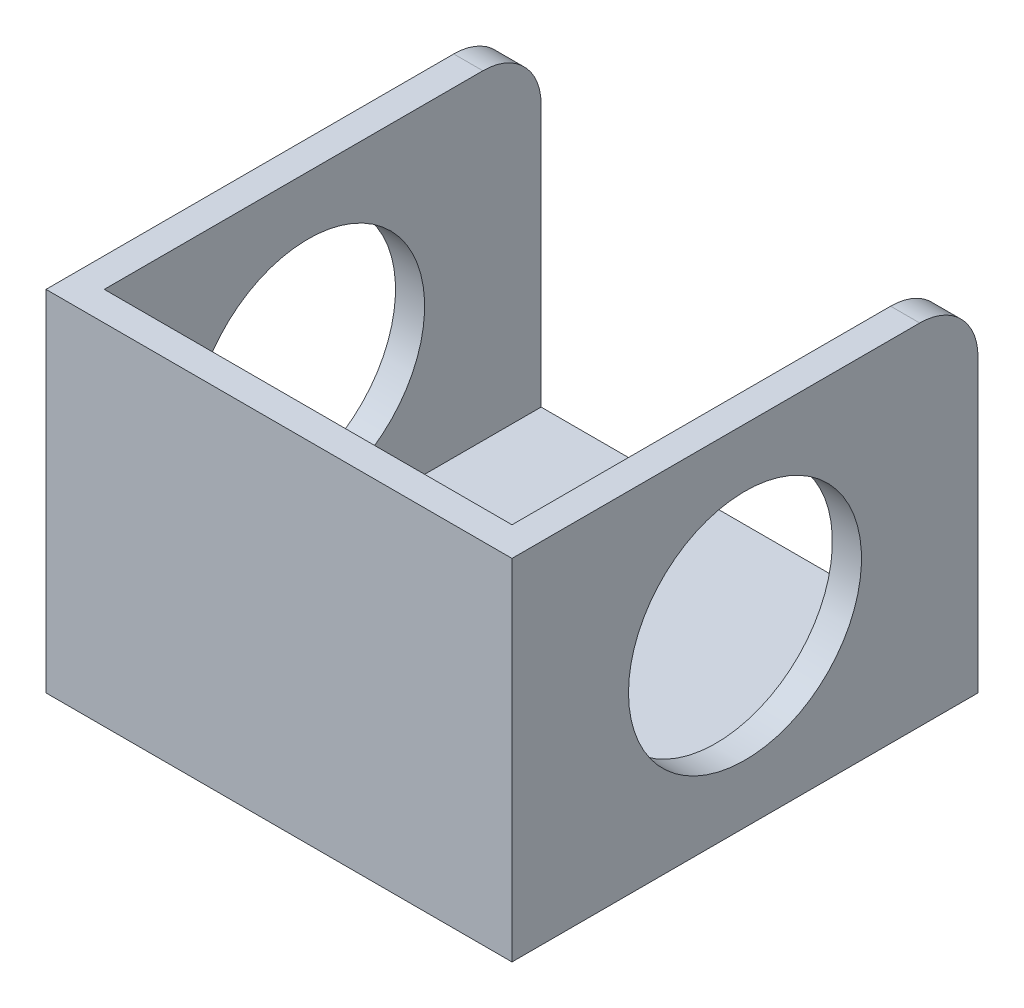
ISO-10303-21;
HEADER;
FILE_DESCRIPTION(('STEP AP214'),'2;1');
FILE_NAME('part.step','',(''),(''),'','','');
FILE_SCHEMA(('AUTOMOTIVE_DESIGN { 1 0 10303 214 1 1 1 1 }'));
ENDSEC;
DATA;
#1=APPLICATION_CONTEXT('core data for automotive mechanical design processes');
#2=APPLICATION_PROTOCOL_DEFINITION('international standard','automotive_design',2000,#1);
#3=PRODUCT_CONTEXT('',#1,'mechanical');
#4=PRODUCT('Part','Part','',(#3));
#5=PRODUCT_RELATED_PRODUCT_CATEGORY('part','',(#4));
#6=PRODUCT_DEFINITION_FORMATION('','',#4);
#7=PRODUCT_DEFINITION_CONTEXT('part definition',#1,'design');
#8=PRODUCT_DEFINITION('design','',#6,#7);
#9=PRODUCT_DEFINITION_SHAPE('','',#8);
#10=(LENGTH_UNIT() NAMED_UNIT(*) SI_UNIT(.MILLI.,.METRE.));
#11=(NAMED_UNIT(*) PLANE_ANGLE_UNIT() SI_UNIT($,.RADIAN.));
#12=(NAMED_UNIT(*) SI_UNIT($,.STERADIAN.) SOLID_ANGLE_UNIT());
#13=UNCERTAINTY_MEASURE_WITH_UNIT(LENGTH_MEASURE(1.E-05),#10,'distance_accuracy_value','');
#14=(GEOMETRIC_REPRESENTATION_CONTEXT(3) GLOBAL_UNCERTAINTY_ASSIGNED_CONTEXT((#13)) GLOBAL_UNIT_ASSIGNED_CONTEXT((#10,
#11,#12)) REPRESENTATION_CONTEXT('',''));
#15=CARTESIAN_POINT('',(0.,0.,0.));
#16=DIRECTION('',(0.,0.,1.));
#17=DIRECTION('',(1.,0.,0.));
#18=AXIS2_PLACEMENT_3D('',#15,#16,#17);
#19=CARTESIAN_POINT('',(0.,152.4,-101.6));
#20=DIRECTION('',(0.,0.,-1.));
#21=DIRECTION('',(-1.,0.,0.));
#22=AXIS2_PLACEMENT_3D('',#19,#20,#21);
#23=PLANE('',#22);
#24=DIRECTION('',(0.,-1.,0.));
#25=VECTOR('',#24,1.);
#26=CARTESIAN_POINT('',(88.8999999999999,152.4,-101.6));
#27=LINE('',#26,#25);
#28=CARTESIAN_POINT('',(88.8999999999999,127.,-101.6));
#29=VERTEX_POINT('',#28);
#30=CARTESIAN_POINT('',(88.8999999999999,12.7,-101.6));
#31=VERTEX_POINT('',#30);
#32=EDGE_CURVE('E135',#29,#31,#27,.T.);
#33=ORIENTED_EDGE('',*,*,#32,.F.);
#34=DIRECTION('',(1.,0.,0.));
#35=VECTOR('',#34,1.);
#36=CARTESIAN_POINT('',(0.,127.,-101.6));
#37=LINE('',#36,#35);
#38=CARTESIAN_POINT('',(101.6,127.,-101.6));
#39=VERTEX_POINT('',#38);
#40=EDGE_CURVE('E198',#29,#39,#37,.T.);
#41=ORIENTED_EDGE('',*,*,#40,.T.);
#42=DIRECTION('',(0.,-1.,0.));
#43=VECTOR('',#42,1.);
#44=CARTESIAN_POINT('',(101.6,152.4,-101.6));
#45=LINE('',#44,#43);
#46=CARTESIAN_POINT('',(101.6,0.,-101.6));
#47=VERTEX_POINT('',#46);
#48=EDGE_CURVE('E180',#39,#47,#45,.T.);
#49=ORIENTED_EDGE('',*,*,#48,.T.);
#50=DIRECTION('',(1.,0.,0.));
#51=VECTOR('',#50,1.);
#52=CARTESIAN_POINT('',(0.,0.,-101.6));
#53=LINE('',#52,#51);
#54=CARTESIAN_POINT('',(-101.6,0.,-101.6));
#55=VERTEX_POINT('',#54);
#56=EDGE_CURVE('E167',#55,#47,#53,.T.);
#57=ORIENTED_EDGE('',*,*,#56,.F.);
#58=DIRECTION('',(0.,-1.,0.));
#59=VECTOR('',#58,1.);
#60=CARTESIAN_POINT('',(-101.6,152.4,-101.6));
#61=LINE('',#60,#59);
#62=CARTESIAN_POINT('',(-101.6,127.,-101.6));
#63=VERTEX_POINT('',#62);
#64=EDGE_CURVE('E178',#63,#55,#61,.T.);
#65=ORIENTED_EDGE('',*,*,#64,.F.);
#66=DIRECTION('',(1.,0.,0.));
#67=VECTOR('',#66,1.);
#68=CARTESIAN_POINT('',(0.,127.,-101.6));
#69=LINE('',#68,#67);
#70=CARTESIAN_POINT('',(-88.9,127.,-101.6));
#71=VERTEX_POINT('',#70);
#72=EDGE_CURVE('E185',#63,#71,#69,.T.);
#73=ORIENTED_EDGE('',*,*,#72,.T.);
#74=DIRECTION('',(0.,-1.,0.));
#75=VECTOR('',#74,1.);
#76=CARTESIAN_POINT('',(-88.9,152.4,-101.6));
#77=LINE('',#76,#75);
#78=CARTESIAN_POINT('',(-88.9,12.7,-101.6));
#79=VERTEX_POINT('',#78);
#80=EDGE_CURVE('E146',#71,#79,#77,.T.);
#81=ORIENTED_EDGE('',*,*,#80,.T.);
#82=DIRECTION('',(1.,0.,0.));
#83=VECTOR('',#82,1.);
#84=CARTESIAN_POINT('',(0.,12.7,-101.6));
#85=LINE('',#84,#83);
#86=EDGE_CURVE('E136',#79,#31,#85,.T.);
#87=ORIENTED_EDGE('',*,*,#86,.T.);
#88=EDGE_LOOP('',(#33,#41,#49,#57,#65,#73,#81,#87));
#89=FACE_BOUND('',#88,.T.);
#90=ADVANCED_FACE('F34',(#89),#23,.T.);
#91=CARTESIAN_POINT('',(101.6,152.4,0.));
#92=DIRECTION('',(-1.,0.,0.));
#93=DIRECTION('',(0.,0.,1.));
#94=AXIS2_PLACEMENT_3D('',#91,#92,#93);
#95=PLANE('',#94);
#96=CARTESIAN_POINT('',(101.6,76.1999999999999,0.));
#97=DIRECTION('',(-1.,0.,0.));
#98=DIRECTION('',(0.,0.,1.));
#99=AXIS2_PLACEMENT_3D('',#96,#97,#98);
#100=CIRCLE('',#99,50.8);
#101=CARTESIAN_POINT('',(101.6,76.1999999999999,50.8));
#102=VERTEX_POINT('',#101);
#103=EDGE_CURVE('E189',#102,#102,#100,.T.);
#104=ORIENTED_EDGE('',*,*,#103,.T.);
#105=EDGE_LOOP('',(#104));
#106=FACE_BOUND('',#105,.T.);
#107=ORIENTED_EDGE('',*,*,#48,.F.);
#108=CARTESIAN_POINT('',(101.6,127.,-76.2));
#109=DIRECTION('',(-1.,0.,0.));
#110=DIRECTION('',(0.,0.,1.));
#111=AXIS2_PLACEMENT_3D('',#108,#109,#110);
#112=CIRCLE('',#111,25.4);
#113=CARTESIAN_POINT('',(101.6,152.4,-76.2));
#114=VERTEX_POINT('',#113);
#115=EDGE_CURVE('E56',#39,#114,#112,.F.);
#116=ORIENTED_EDGE('',*,*,#115,.T.);
#117=DIRECTION('',(0.,0.,-1.));
#118=VECTOR('',#117,1.);
#119=CARTESIAN_POINT('',(101.6,152.4,0.));
#120=LINE('',#119,#118);
#121=CARTESIAN_POINT('',(101.6,152.4,101.6));
#122=VERTEX_POINT('',#121);
#123=EDGE_CURVE('E156',#122,#114,#120,.T.);
#124=ORIENTED_EDGE('',*,*,#123,.F.);
#125=DIRECTION('',(0.,-1.,0.));
#126=VECTOR('',#125,1.);
#127=CARTESIAN_POINT('',(101.6,152.4,101.6));
#128=LINE('',#127,#126);
#129=CARTESIAN_POINT('',(101.6,0.,101.6));
#130=VERTEX_POINT('',#129);
#131=EDGE_CURVE('E164',#122,#130,#128,.T.);
#132=ORIENTED_EDGE('',*,*,#131,.T.);
#133=DIRECTION('',(0.,0.,-1.));
#134=VECTOR('',#133,1.);
#135=CARTESIAN_POINT('',(101.6,0.,0.));
#136=LINE('',#135,#134);
#137=EDGE_CURVE('E148',#130,#47,#136,.T.);
#138=ORIENTED_EDGE('',*,*,#137,.T.);
#139=EDGE_LOOP('',(#107,#116,#124,#132,#138));
#140=FACE_BOUND('',#139,.T.);
#141=ADVANCED_FACE('F206',(#106,#140),#95,.F.);
#142=CARTESIAN_POINT('',(-101.6,152.4,0.));
#143=DIRECTION('',(-1.,0.,0.));
#144=DIRECTION('',(0.,0.,1.));
#145=AXIS2_PLACEMENT_3D('',#142,#143,#144);
#146=PLANE('',#145);
#147=CARTESIAN_POINT('',(-101.6,76.1999999999999,0.));
#148=DIRECTION('',(-1.,0.,0.));
#149=DIRECTION('',(0.,0.,1.));
#150=AXIS2_PLACEMENT_3D('',#147,#148,#149);
#151=CIRCLE('',#150,50.8);
#152=CARTESIAN_POINT('',(-101.6,76.1999999999999,50.8));
#153=VERTEX_POINT('',#152);
#154=EDGE_CURVE('E281',#153,#153,#151,.T.);
#155=ORIENTED_EDGE('',*,*,#154,.F.);
#156=EDGE_LOOP('',(#155));
#157=FACE_BOUND('',#156,.T.);
#158=DIRECTION('',(0.,0.,-1.));
#159=VECTOR('',#158,1.);
#160=CARTESIAN_POINT('',(-101.6,152.4,0.));
#161=LINE('',#160,#159);
#162=CARTESIAN_POINT('',(-101.6,152.4,101.6));
#163=VERTEX_POINT('',#162);
#164=CARTESIAN_POINT('',(-101.6,152.4,-76.2));
#165=VERTEX_POINT('',#164);
#166=EDGE_CURVE('E158',#163,#165,#161,.T.);
#167=ORIENTED_EDGE('',*,*,#166,.T.);
#168=CARTESIAN_POINT('',(-101.6,127.,-76.2));
#169=DIRECTION('',(-1.,0.,0.));
#170=DIRECTION('',(0.,0.,1.));
#171=AXIS2_PLACEMENT_3D('',#168,#169,#170);
#172=CIRCLE('',#171,25.4);
#173=EDGE_CURVE('E196',#165,#63,#172,.T.);
#174=ORIENTED_EDGE('',*,*,#173,.T.);
#175=ORIENTED_EDGE('',*,*,#64,.T.);
#176=DIRECTION('',(0.,0.,-1.));
#177=VECTOR('',#176,1.);
#178=CARTESIAN_POINT('',(-101.6,0.,0.));
#179=LINE('',#178,#177);
#180=CARTESIAN_POINT('',(-101.6,0.,101.6));
#181=VERTEX_POINT('',#180);
#182=EDGE_CURVE('E170',#181,#55,#179,.T.);
#183=ORIENTED_EDGE('',*,*,#182,.F.);
#184=DIRECTION('',(0.,-1.,0.));
#185=VECTOR('',#184,1.);
#186=CARTESIAN_POINT('',(-101.6,152.4,101.6));
#187=LINE('',#186,#185);
#188=EDGE_CURVE('E176',#163,#181,#187,.T.);
#189=ORIENTED_EDGE('',*,*,#188,.F.);
#190=EDGE_LOOP('',(#167,#174,#175,#183,#189));
#191=FACE_BOUND('',#190,.T.);
#192=ADVANCED_FACE('F235',(#157,#191),#146,.T.);
#193=CARTESIAN_POINT('',(0.,152.4,101.6));
#194=DIRECTION('',(0.,0.,-1.));
#195=DIRECTION('',(-1.,0.,0.));
#196=AXIS2_PLACEMENT_3D('',#193,#194,#195);
#197=PLANE('',#196);
#198=DIRECTION('',(1.,0.,0.));
#199=VECTOR('',#198,1.);
#200=CARTESIAN_POINT('',(0.,0.,101.6));
#201=LINE('',#200,#199);
#202=EDGE_CURVE('E159',#181,#130,#201,.T.);
#203=ORIENTED_EDGE('',*,*,#202,.T.);
#204=ORIENTED_EDGE('',*,*,#131,.F.);
#205=DIRECTION('',(1.,0.,0.));
#206=VECTOR('',#205,1.);
#207=CARTESIAN_POINT('',(0.,152.4,101.6));
#208=LINE('',#207,#206);
#209=EDGE_CURVE('E162',#163,#122,#208,.T.);
#210=ORIENTED_EDGE('',*,*,#209,.F.);
#211=ORIENTED_EDGE('',*,*,#188,.T.);
#212=EDGE_LOOP('',(#203,#204,#210,#211));
#213=FACE_BOUND('',#212,.T.);
#214=ADVANCED_FACE('F241',(#213),#197,.F.);
#215=CARTESIAN_POINT('',(0.,152.4,0.));
#216=DIRECTION('',(0.,1.,0.));
#217=DIRECTION('',(0.,0.,1.));
#218=AXIS2_PLACEMENT_3D('',#215,#216,#217);
#219=PLANE('',#218);
#220=ORIENTED_EDGE('',*,*,#123,.T.);
#221=DIRECTION('',(1.,0.,0.));
#222=VECTOR('',#221,1.);
#223=CARTESIAN_POINT('',(0.,152.4,-76.2));
#224=LINE('',#223,#222);
#225=CARTESIAN_POINT('',(88.8999999999999,152.4,-76.2));
#226=VERTEX_POINT('',#225);
#227=EDGE_CURVE('E42',#114,#226,#224,.F.);
#228=ORIENTED_EDGE('',*,*,#227,.T.);
#229=DIRECTION('',(0.,0.,-1.));
#230=VECTOR('',#229,1.);
#231=CARTESIAN_POINT('',(88.8999999999999,152.4,0.));
#232=LINE('',#231,#230);
#233=CARTESIAN_POINT('',(88.8999999999999,152.4,88.9));
#234=VERTEX_POINT('',#233);
#235=EDGE_CURVE('E123',#234,#226,#232,.T.);
#236=ORIENTED_EDGE('',*,*,#235,.F.);
#237=DIRECTION('',(1.,0.,0.));
#238=VECTOR('',#237,1.);
#239=CARTESIAN_POINT('',(0.,152.4,88.9));
#240=LINE('',#239,#238);
#241=CARTESIAN_POINT('',(-88.9,152.4,88.9));
#242=VERTEX_POINT('',#241);
#243=EDGE_CURVE('E129',#242,#234,#240,.T.);
#244=ORIENTED_EDGE('',*,*,#243,.F.);
#245=DIRECTION('',(0.,0.,-1.));
#246=VECTOR('',#245,1.);
#247=CARTESIAN_POINT('',(-88.9,152.4,0.));
#248=LINE('',#247,#246);
#249=CARTESIAN_POINT('',(-88.9,152.4,-76.2));
#250=VERTEX_POINT('',#249);
#251=EDGE_CURVE('E151',#242,#250,#248,.T.);
#252=ORIENTED_EDGE('',*,*,#251,.T.);
#253=DIRECTION('',(1.,0.,0.));
#254=VECTOR('',#253,1.);
#255=CARTESIAN_POINT('',(0.,152.4,-76.2));
#256=LINE('',#255,#254);
#257=EDGE_CURVE('E194',#250,#165,#256,.F.);
#258=ORIENTED_EDGE('',*,*,#257,.T.);
#259=ORIENTED_EDGE('',*,*,#166,.F.);
#260=ORIENTED_EDGE('',*,*,#209,.T.);
#261=EDGE_LOOP('',(#220,#228,#236,#244,#252,#258,#259,#260));
#262=FACE_BOUND('',#261,.T.);
#263=ADVANCED_FACE('F223',(#262),#219,.T.);
#264=CARTESIAN_POINT('',(0.,0.,0.));
#265=DIRECTION('',(0.,1.,0.));
#266=DIRECTION('',(0.,0.,1.));
#267=AXIS2_PLACEMENT_3D('',#264,#265,#266);
#268=PLANE('',#267);
#269=CARTESIAN_POINT('',(0.,0.,0.));
#270=DIRECTION('',(0.,1.,0.));
#271=DIRECTION('',(0.,0.,1.));
#272=AXIS2_PLACEMENT_3D('',#269,#270,#271);
#273=CIRCLE('',#272,22.86);
#274=CARTESIAN_POINT('',(0.,0.,22.86));
#275=VERTEX_POINT('',#274);
#276=EDGE_CURVE('E182',#275,#275,#273,.F.);
#277=ORIENTED_EDGE('',*,*,#276,.F.);
#278=EDGE_LOOP('',(#277));
#279=FACE_BOUND('',#278,.T.);
#280=ORIENTED_EDGE('',*,*,#137,.F.);
#281=ORIENTED_EDGE('',*,*,#202,.F.);
#282=ORIENTED_EDGE('',*,*,#182,.T.);
#283=ORIENTED_EDGE('',*,*,#56,.T.);
#284=EDGE_LOOP('',(#280,#281,#282,#283));
#285=FACE_BOUND('',#284,.T.);
#286=ADVANCED_FACE('F211',(#279,#285),#268,.F.);
#287=CARTESIAN_POINT('',(88.8999999999999,152.4,0.));
#288=DIRECTION('',(-1.,0.,0.));
#289=DIRECTION('',(0.,0.,1.));
#290=AXIS2_PLACEMENT_3D('',#287,#288,#289);
#291=PLANE('',#290);
#292=CARTESIAN_POINT('',(88.8999999999999,76.1999999999999,0.));
#293=DIRECTION('',(-1.,0.,0.));
#294=DIRECTION('',(0.,0.,1.));
#295=AXIS2_PLACEMENT_3D('',#292,#293,#294);
#296=CIRCLE('',#295,50.8);
#297=CARTESIAN_POINT('',(88.8999999999999,76.1999999999999,50.8));
#298=VERTEX_POINT('',#297);
#299=EDGE_CURVE('E141',#298,#298,#296,.T.);
#300=ORIENTED_EDGE('',*,*,#299,.F.);
#301=EDGE_LOOP('',(#300));
#302=FACE_BOUND('',#301,.T.);
#303=ORIENTED_EDGE('',*,*,#235,.T.);
#304=CARTESIAN_POINT('',(88.8999999999999,127.,-76.2));
#305=DIRECTION('',(-1.,0.,0.));
#306=DIRECTION('',(0.,0.,1.));
#307=AXIS2_PLACEMENT_3D('',#304,#305,#306);
#308=CIRCLE('',#307,25.4);
#309=EDGE_CURVE('E11',#226,#29,#308,.T.);
#310=ORIENTED_EDGE('',*,*,#309,.T.);
#311=ORIENTED_EDGE('',*,*,#32,.T.);
#312=DIRECTION('',(0.,0.,-1.));
#313=VECTOR('',#312,1.);
#314=CARTESIAN_POINT('',(88.8999999999999,12.7,0.));
#315=LINE('',#314,#313);
#316=CARTESIAN_POINT('',(88.8999999999999,12.7,88.9));
#317=VERTEX_POINT('',#316);
#318=EDGE_CURVE('E117',#317,#31,#315,.T.);
#319=ORIENTED_EDGE('',*,*,#318,.F.);
#320=DIRECTION('',(0.,-1.,0.));
#321=VECTOR('',#320,1.);
#322=CARTESIAN_POINT('',(88.8999999999999,152.4,88.9));
#323=LINE('',#322,#321);
#324=EDGE_CURVE('E126',#234,#317,#323,.T.);
#325=ORIENTED_EDGE('',*,*,#324,.F.);
#326=EDGE_LOOP('',(#303,#310,#311,#319,#325));
#327=FACE_BOUND('',#326,.T.);
#328=ADVANCED_FACE('F133',(#302,#327),#291,.T.);
#329=CARTESIAN_POINT('',(-88.9,152.4,0.));
#330=DIRECTION('',(-1.,0.,0.));
#331=DIRECTION('',(0.,0.,1.));
#332=AXIS2_PLACEMENT_3D('',#329,#330,#331);
#333=PLANE('',#332);
#334=CARTESIAN_POINT('',(-88.9,76.1999999999999,0.));
#335=DIRECTION('',(-1.,0.,0.));
#336=DIRECTION('',(0.,0.,1.));
#337=AXIS2_PLACEMENT_3D('',#334,#335,#336);
#338=CIRCLE('',#337,50.8);
#339=CARTESIAN_POINT('',(-88.9,76.1999999999999,50.8));
#340=VERTEX_POINT('',#339);
#341=EDGE_CURVE('E186',#340,#340,#338,.T.);
#342=ORIENTED_EDGE('',*,*,#341,.T.);
#343=EDGE_LOOP('',(#342));
#344=FACE_BOUND('',#343,.T.);
#345=ORIENTED_EDGE('',*,*,#80,.F.);
#346=CARTESIAN_POINT('',(-88.9,127.,-76.2));
#347=DIRECTION('',(-1.,0.,0.));
#348=DIRECTION('',(0.,0.,1.));
#349=AXIS2_PLACEMENT_3D('',#346,#347,#348);
#350=CIRCLE('',#349,25.4);
#351=EDGE_CURVE('E192',#71,#250,#350,.F.);
#352=ORIENTED_EDGE('',*,*,#351,.T.);
#353=ORIENTED_EDGE('',*,*,#251,.F.);
#354=DIRECTION('',(0.,-1.,0.));
#355=VECTOR('',#354,1.);
#356=CARTESIAN_POINT('',(-88.9,152.4,88.9));
#357=LINE('',#356,#355);
#358=CARTESIAN_POINT('',(-88.9,12.7,88.9));
#359=VERTEX_POINT('',#358);
#360=EDGE_CURVE('E131',#242,#359,#357,.T.);
#361=ORIENTED_EDGE('',*,*,#360,.T.);
#362=DIRECTION('',(0.,0.,-1.));
#363=VECTOR('',#362,1.);
#364=CARTESIAN_POINT('',(-88.9,12.7,0.));
#365=LINE('',#364,#363);
#366=EDGE_CURVE('E120',#359,#79,#365,.T.);
#367=ORIENTED_EDGE('',*,*,#366,.T.);
#368=EDGE_LOOP('',(#345,#352,#353,#361,#367));
#369=FACE_BOUND('',#368,.T.);
#370=ADVANCED_FACE('F222',(#344,#369),#333,.F.);
#371=CARTESIAN_POINT('',(0.,152.4,88.9));
#372=DIRECTION('',(0.,0.,-1.));
#373=DIRECTION('',(-1.,0.,0.));
#374=AXIS2_PLACEMENT_3D('',#371,#372,#373);
#375=PLANE('',#374);
#376=DIRECTION('',(1.,0.,0.));
#377=VECTOR('',#376,1.);
#378=CARTESIAN_POINT('',(0.,12.7,88.9));
#379=LINE('',#378,#377);
#380=EDGE_CURVE('E112',#359,#317,#379,.T.);
#381=ORIENTED_EDGE('',*,*,#380,.F.);
#382=ORIENTED_EDGE('',*,*,#360,.F.);
#383=ORIENTED_EDGE('',*,*,#243,.T.);
#384=ORIENTED_EDGE('',*,*,#324,.T.);
#385=EDGE_LOOP('',(#381,#382,#383,#384));
#386=FACE_BOUND('',#385,.T.);
#387=ADVANCED_FACE('F127',(#386),#375,.T.);
#388=CARTESIAN_POINT('',(0.,12.7,0.));
#389=DIRECTION('',(0.,1.,0.));
#390=DIRECTION('',(0.,0.,1.));
#391=AXIS2_PLACEMENT_3D('',#388,#389,#390);
#392=PLANE('',#391);
#393=ORIENTED_EDGE('',*,*,#318,.T.);
#394=ORIENTED_EDGE('',*,*,#86,.F.);
#395=ORIENTED_EDGE('',*,*,#366,.F.);
#396=ORIENTED_EDGE('',*,*,#380,.T.);
#397=EDGE_LOOP('',(#393,#394,#395,#396));
#398=FACE_BOUND('',#397,.T.);
#399=ADVANCED_FACE('F114',(#398),#392,.T.);
#400=CARTESIAN_POINT('',(0.,-30.48,0.));
#401=DIRECTION('',(0.,1.,0.));
#402=DIRECTION('',(0.,0.,1.));
#403=AXIS2_PLACEMENT_3D('',#400,#401,#402);
#404=CYLINDRICAL_SURFACE('',#403,22.86);
#405=CARTESIAN_POINT('',(0.,-30.48,0.));
#406=DIRECTION('',(0.,-1.,0.));
#407=DIRECTION('',(0.,0.,-1.));
#408=AXIS2_PLACEMENT_3D('',#405,#406,#407);
#409=CIRCLE('',#408,22.86);
#410=CARTESIAN_POINT('',(0.,-30.48,22.86));
#411=VERTEX_POINT('',#410);
#412=EDGE_CURVE('E137',#411,#411,#409,.T.);
#413=CARTESIAN_POINT('',(0.,-30.48,22.86));
#414=CARTESIAN_POINT('',(0.,-30.1625,22.86));
#415=CARTESIAN_POINT('',(0.,-29.845,22.86));
#416=CARTESIAN_POINT('',(0.,-29.21,22.86));
#417=CARTESIAN_POINT('',(0.,-28.8925,22.86));
#418=CARTESIAN_POINT('',(0.,-28.2575,22.86));
#419=CARTESIAN_POINT('',(0.,-27.94,22.86));
#420=CARTESIAN_POINT('',(0.,-27.305,22.86));
#421=CARTESIAN_POINT('',(0.,-26.9875,22.86));
#422=CARTESIAN_POINT('',(0.,-26.3525,22.86));
#423=CARTESIAN_POINT('',(0.,-26.035,22.86));
#424=CARTESIAN_POINT('',(0.,-25.4,22.86));
#425=CARTESIAN_POINT('',(0.,-25.0825,22.86));
#426=CARTESIAN_POINT('',(0.,-24.4475,22.86));
#427=CARTESIAN_POINT('',(0.,-24.13,22.86));
#428=CARTESIAN_POINT('',(0.,-23.495,22.86));
#429=CARTESIAN_POINT('',(0.,-23.1775,22.86));
#430=CARTESIAN_POINT('',(0.,-22.5425,22.86));
#431=CARTESIAN_POINT('',(0.,-22.225,22.86));
#432=CARTESIAN_POINT('',(0.,-21.59,22.86));
#433=CARTESIAN_POINT('',(0.,-21.2725,22.86));
#434=CARTESIAN_POINT('',(0.,-20.6375,22.86));
#435=CARTESIAN_POINT('',(0.,-20.32,22.86));
#436=CARTESIAN_POINT('',(0.,-19.685,22.86));
#437=CARTESIAN_POINT('',(0.,-19.3675,22.86));
#438=CARTESIAN_POINT('',(0.,-18.7325,22.86));
#439=CARTESIAN_POINT('',(0.,-18.415,22.86));
#440=CARTESIAN_POINT('',(0.,-17.78,22.86));
#441=CARTESIAN_POINT('',(0.,-17.4625,22.86));
#442=CARTESIAN_POINT('',(0.,-16.8275,22.86));
#443=CARTESIAN_POINT('',(0.,-16.51,22.86));
#444=CARTESIAN_POINT('',(0.,-15.875,22.86));
#445=CARTESIAN_POINT('',(0.,-15.5575,22.86));
#446=CARTESIAN_POINT('',(0.,-14.9225,22.86));
#447=CARTESIAN_POINT('',(0.,-14.605,22.86));
#448=CARTESIAN_POINT('',(0.,-13.97,22.86));
#449=CARTESIAN_POINT('',(0.,-13.6525,22.86));
#450=CARTESIAN_POINT('',(0.,-13.0175,22.86));
#451=CARTESIAN_POINT('',(0.,-12.7,22.86));
#452=CARTESIAN_POINT('',(0.,-12.065,22.86));
#453=CARTESIAN_POINT('',(0.,-11.7475,22.86));
#454=CARTESIAN_POINT('',(0.,-11.1125,22.86));
#455=CARTESIAN_POINT('',(0.,-10.795,22.86));
#456=CARTESIAN_POINT('',(0.,-10.16,22.86));
#457=CARTESIAN_POINT('',(0.,-9.8425,22.86));
#458=CARTESIAN_POINT('',(0.,-9.2075,22.86));
#459=CARTESIAN_POINT('',(0.,-8.89,22.86));
#460=CARTESIAN_POINT('',(0.,-8.255,22.86));
#461=CARTESIAN_POINT('',(0.,-7.9375,22.86));
#462=CARTESIAN_POINT('',(0.,-7.3025,22.86));
#463=CARTESIAN_POINT('',(0.,-6.985,22.86));
#464=CARTESIAN_POINT('',(0.,-6.35,22.86));
#465=CARTESIAN_POINT('',(0.,-6.0325,22.86));
#466=CARTESIAN_POINT('',(0.,-5.3975,22.86));
#467=CARTESIAN_POINT('',(0.,-5.08,22.86));
#468=CARTESIAN_POINT('',(0.,-4.445,22.86));
#469=CARTESIAN_POINT('',(0.,-4.1275,22.86));
#470=CARTESIAN_POINT('',(0.,-3.4925,22.86));
#471=CARTESIAN_POINT('',(0.,-3.175,22.86));
#472=CARTESIAN_POINT('',(0.,-2.54,22.86));
#473=CARTESIAN_POINT('',(0.,-2.2225,22.86));
#474=CARTESIAN_POINT('',(0.,-1.5875,22.86));
#475=CARTESIAN_POINT('',(0.,-1.27,22.86));
#476=CARTESIAN_POINT('',(0.,-0.634999999999999,22.86));
#477=CARTESIAN_POINT('',(0.,-0.3175,22.86));
#478=CARTESIAN_POINT('',(0.,0.,22.86));
#479=B_SPLINE_CURVE_WITH_KNOTS('',3,(#413,#414,#415,#416,#417,#418,#419,#420,#421,#422,#423,
#424,#425,#426,#427,#428,#429,#430,#431,#432,#433,#434,#435,#436,#437,#438,#439,#440,#441,#442,
#443,#444,#445,#446,#447,#448,#449,#450,#451,#452,#453,#454,#455,#456,#457,#458,#459,#460,#461,
#462,#463,#464,#465,#466,#467,#468,#469,#470,#471,#472,#473,#474,#475,#476,#477,#478),
.UNSPECIFIED.,.F.,.F.,(4,2,2,2,2,2,2,2,2,2,2,2,2,2,2,2,2,2,2,2,2,2,2,2,2,2,2,2,2,2,2,2,4),(0.,
0.952499999999998,1.905,2.8575,3.81,4.7625,5.715,6.6675,7.61999999999999,8.5725,9.525,10.4775,
11.43,12.3825,13.335,14.2875,15.24,16.1925,17.145,18.0975,19.05,20.0025,20.955,21.9075,22.86,
23.8125,24.765,25.7175,26.67,27.6225,28.575,29.5275,30.48),.UNSPECIFIED.);
#480=EDGE_CURVE('BSEAM253',#411,#275,#479,.T.);
#481=ORIENTED_EDGE('',*,*,#412,.F.);
#482=ORIENTED_EDGE('',*,*,#276,.T.);
#483=ORIENTED_EDGE('',*,*,#480,.T.);
#484=ORIENTED_EDGE('',*,*,#480,.F.);
#485=EDGE_LOOP('',(#481,#483,#482,#484));
#486=FACE_BOUND('',#485,.T.);
#487=ADVANCED_FACE('F253',(#486),#404,.T.);
#488=CARTESIAN_POINT('',(0.,-30.48,0.));
#489=DIRECTION('',(0.,-1.,0.));
#490=DIRECTION('',(0.,0.,-1.));
#491=AXIS2_PLACEMENT_3D('',#488,#489,#490);
#492=PLANE('',#491);
#493=ORIENTED_EDGE('',*,*,#412,.T.);
#494=EDGE_LOOP('',(#493));
#495=FACE_BOUND('',#494,.T.);
#496=ADVANCED_FACE('F264',(#495),#492,.T.);
#497=CARTESIAN_POINT('',(101.6,76.1999999999999,0.));
#498=DIRECTION('',(-1.,0.,0.));
#499=DIRECTION('',(0.,0.,1.));
#500=AXIS2_PLACEMENT_3D('',#497,#498,#499);
#501=CYLINDRICAL_SURFACE('',#500,50.8);
#502=ORIENTED_EDGE('',*,*,#154,.T.);
#503=EDGE_LOOP('',(#502));
#504=FACE_BOUND('',#503,.T.);
#505=ORIENTED_EDGE('',*,*,#341,.F.);
#506=EDGE_LOOP('',(#505));
#507=FACE_BOUND('',#506,.T.);
#508=ADVANCED_FACE('F268',(#504,#507),#501,.F.);
#509=ORIENTED_EDGE('',*,*,#299,.T.);
#510=EDGE_LOOP('',(#509));
#511=FACE_BOUND('',#510,.T.);
#512=ORIENTED_EDGE('',*,*,#103,.F.);
#513=EDGE_LOOP('',(#512));
#514=FACE_BOUND('',#513,.T.);
#515=ADVANCED_FACE('F229',(#511,#514),#501,.F.);
#516=CARTESIAN_POINT('',(0.,127.,-76.2));
#517=DIRECTION('',(1.,0.,0.));
#518=DIRECTION('',(0.,0.,-1.));
#519=AXIS2_PLACEMENT_3D('',#516,#517,#518);
#520=CYLINDRICAL_SURFACE('',#519,25.4);
#521=ORIENTED_EDGE('',*,*,#173,.F.);
#522=ORIENTED_EDGE('',*,*,#257,.F.);
#523=ORIENTED_EDGE('',*,*,#351,.F.);
#524=ORIENTED_EDGE('',*,*,#72,.F.);
#525=EDGE_LOOP('',(#521,#522,#523,#524));
#526=FACE_BOUND('',#525,.T.);
#527=ADVANCED_FACE('F219',(#526),#520,.T.);
#528=CARTESIAN_POINT('',(0.,127.,-76.2));
#529=DIRECTION('',(1.,0.,0.));
#530=DIRECTION('',(0.,0.,-1.));
#531=AXIS2_PLACEMENT_3D('',#528,#529,#530);
#532=CYLINDRICAL_SURFACE('',#531,25.4);
#533=ORIENTED_EDGE('',*,*,#309,.F.);
#534=ORIENTED_EDGE('',*,*,#227,.F.);
#535=ORIENTED_EDGE('',*,*,#115,.F.);
#536=ORIENTED_EDGE('',*,*,#40,.F.);
#537=EDGE_LOOP('',(#533,#534,#535,#536));
#538=FACE_BOUND('',#537,.T.);
#539=ADVANCED_FACE('F36',(#538),#532,.T.);
#540=CLOSED_SHELL('',(#90,#141,#192,#214,#263,#286,#328,#370,#387,#399,#487,#496,#508,#515,#527,#539));
#541=MANIFOLD_SOLID_BREP('B2',#540);
#542=ADVANCED_BREP_SHAPE_REPRESENTATION('',(#18,#541),#14);
#543=SHAPE_DEFINITION_REPRESENTATION(#9,#542);
ENDSEC;
END-ISO-10303-21;
